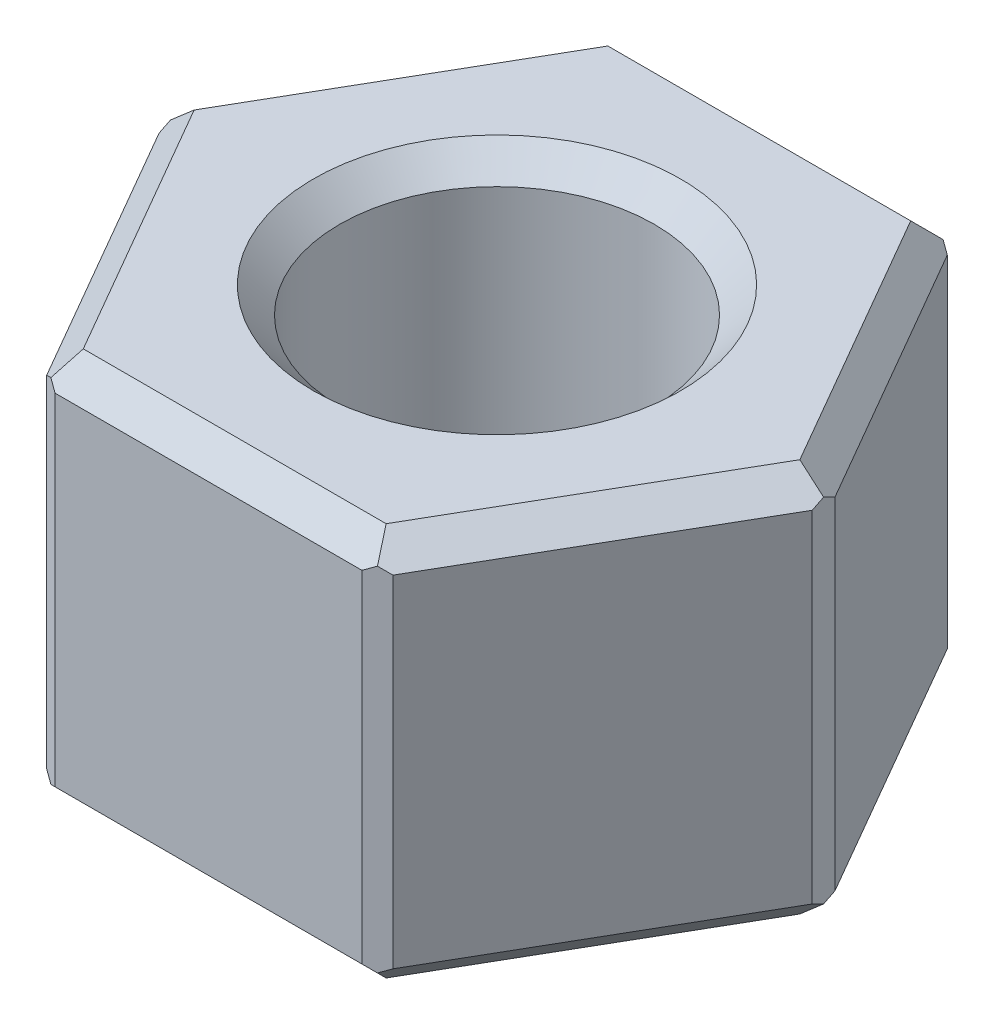
ISO-10303-21;
HEADER;
FILE_DESCRIPTION(('STEP AP214'),'2;1');
FILE_NAME('part.step','',(''),(''),'','','');
FILE_SCHEMA(('AUTOMOTIVE_DESIGN { 1 0 10303 214 1 1 1 1 }'));
ENDSEC;
DATA;
#1=APPLICATION_CONTEXT('core data for automotive mechanical design processes');
#2=APPLICATION_PROTOCOL_DEFINITION('international standard','automotive_design',2000,#1);
#3=PRODUCT_CONTEXT('',#1,'mechanical');
#4=PRODUCT('Part','Part','',(#3));
#5=PRODUCT_RELATED_PRODUCT_CATEGORY('part','',(#4));
#6=PRODUCT_DEFINITION_FORMATION('','',#4);
#7=PRODUCT_DEFINITION_CONTEXT('part definition',#1,'design');
#8=PRODUCT_DEFINITION('design','',#6,#7);
#9=PRODUCT_DEFINITION_SHAPE('','',#8);
#10=(LENGTH_UNIT() NAMED_UNIT(*) SI_UNIT(.MILLI.,.METRE.));
#11=(NAMED_UNIT(*) PLANE_ANGLE_UNIT() SI_UNIT($,.RADIAN.));
#12=(NAMED_UNIT(*) SI_UNIT($,.STERADIAN.) SOLID_ANGLE_UNIT());
#13=UNCERTAINTY_MEASURE_WITH_UNIT(LENGTH_MEASURE(1.E-05),#10,'distance_accuracy_value','');
#14=(GEOMETRIC_REPRESENTATION_CONTEXT(3) GLOBAL_UNCERTAINTY_ASSIGNED_CONTEXT((#13)) GLOBAL_UNIT_ASSIGNED_CONTEXT((#10,
#11,#12)) REPRESENTATION_CONTEXT('',''));
#15=CARTESIAN_POINT('',(0.,0.,0.));
#16=DIRECTION('',(0.,0.,1.));
#17=DIRECTION('',(1.,0.,0.));
#18=AXIS2_PLACEMENT_3D('',#15,#16,#17);
#19=CARTESIAN_POINT('',(0.,15.,0.));
#20=DIRECTION('',(0.,1.,0.));
#21=DIRECTION('',(0.,0.,1.));
#22=AXIS2_PLACEMENT_3D('',#19,#20,#21);
#23=PLANE('',#22);
#24=CARTESIAN_POINT('',(0.,15.,0.));
#25=DIRECTION('',(0.,1.,0.));
#26=DIRECTION('',(0.,0.,1.));
#27=AXIS2_PLACEMENT_3D('',#24,#25,#26);
#28=CIRCLE('',#27,7.00000000000001);
#29=CARTESIAN_POINT('',(0.,15.,7.00000000000001));
#30=VERTEX_POINT('',#29);
#31=EDGE_CURVE('E302',#30,#30,#28,.F.);
#32=ORIENTED_EDGE('',*,*,#31,.T.);
#33=EDGE_LOOP('',(#32));
#34=FACE_BOUND('',#33,.T.);
#35=DIRECTION('',(-0.5,0.,0.866025403784439));
#36=VECTOR('',#35,1.);
#37=CARTESIAN_POINT('',(-11.8356805183873,15.,0.499999999999998));
#38=LINE('',#37,#36);
#39=CARTESIAN_POINT('',(-5.77350269189626,15.,-10.));
#40=VERTEX_POINT('',#39);
#41=CARTESIAN_POINT('',(-11.5470053837925,15.,0.));
#42=VERTEX_POINT('',#41);
#43=EDGE_CURVE('E297',#40,#42,#38,.T.);
#44=ORIENTED_EDGE('',*,*,#43,.T.);
#45=DIRECTION('',(0.5,0.,0.866025403784439));
#46=VECTOR('',#45,1.);
#47=CARTESIAN_POINT('',(-5.48482755730145,15.,10.5));
#48=LINE('',#47,#46);
#49=CARTESIAN_POINT('',(-5.77350269189626,15.,10.));
#50=VERTEX_POINT('',#49);
#51=EDGE_CURVE('E299',#42,#50,#48,.T.);
#52=ORIENTED_EDGE('',*,*,#51,.T.);
#53=DIRECTION('',(1.,0.,0.));
#54=VECTOR('',#53,1.);
#55=CARTESIAN_POINT('',(6.35085296108588,15.,10.));
#56=LINE('',#55,#54);
#57=CARTESIAN_POINT('',(5.77350269189626,15.,10.));
#58=VERTEX_POINT('',#57);
#59=EDGE_CURVE('E287',#50,#58,#56,.T.);
#60=ORIENTED_EDGE('',*,*,#59,.T.);
#61=DIRECTION('',(0.5,0.,-0.866025403784439));
#62=VECTOR('',#61,1.);
#63=CARTESIAN_POINT('',(11.8356805183873,15.,-0.500000000000003));
#64=LINE('',#63,#62);
#65=CARTESIAN_POINT('',(11.5470053837925,15.,0.));
#66=VERTEX_POINT('',#65);
#67=EDGE_CURVE('E290',#58,#66,#64,.T.);
#68=ORIENTED_EDGE('',*,*,#67,.T.);
#69=DIRECTION('',(-0.5,0.,-0.866025403784439));
#70=VECTOR('',#69,1.);
#71=CARTESIAN_POINT('',(5.48482755730145,15.,-10.5));
#72=LINE('',#71,#70);
#73=CARTESIAN_POINT('',(5.77350269189626,15.,-10.));
#74=VERTEX_POINT('',#73);
#75=EDGE_CURVE('E293',#66,#74,#72,.T.);
#76=ORIENTED_EDGE('',*,*,#75,.T.);
#77=DIRECTION('',(-1.,0.,0.));
#78=VECTOR('',#77,1.);
#79=CARTESIAN_POINT('',(-6.35085296108588,15.,-10.));
#80=LINE('',#79,#78);
#81=EDGE_CURVE('E295',#74,#40,#80,.T.);
#82=ORIENTED_EDGE('',*,*,#81,.T.);
#83=EDGE_LOOP('',(#44,#52,#60,#68,#76,#82));
#84=FACE_BOUND('',#83,.T.);
#85=ADVANCED_FACE('F49',(#34,#84),#23,.T.);
#86=CARTESIAN_POINT('',(0.,0.,0.));
#87=DIRECTION('',(0.,1.,0.));
#88=DIRECTION('',(0.,0.,1.));
#89=AXIS2_PLACEMENT_3D('',#86,#87,#88);
#90=PLANE('',#89);
#91=CARTESIAN_POINT('',(0.,0.,0.));
#92=DIRECTION('',(0.,1.,0.));
#93=DIRECTION('',(0.,0.,1.));
#94=AXIS2_PLACEMENT_3D('',#91,#92,#93);
#95=CIRCLE('',#94,7.);
#96=CARTESIAN_POINT('',(0.,0.,7.));
#97=VERTEX_POINT('',#96);
#98=EDGE_CURVE('E239',#97,#97,#95,.T.);
#99=ORIENTED_EDGE('',*,*,#98,.T.);
#100=EDGE_LOOP('',(#99));
#101=FACE_BOUND('',#100,.T.);
#102=DIRECTION('',(0.5,0.,0.866025403784439));
#103=VECTOR('',#102,1.);
#104=CARTESIAN_POINT('',(8.66025403784439,0.,-5.));
#105=LINE('',#104,#103);
#106=CARTESIAN_POINT('',(5.77350269189626,0.,-10.));
#107=VERTEX_POINT('',#106);
#108=CARTESIAN_POINT('',(11.5470053837925,0.,0.));
#109=VERTEX_POINT('',#108);
#110=EDGE_CURVE('E238',#107,#109,#105,.T.);
#111=ORIENTED_EDGE('',*,*,#110,.T.);
#112=DIRECTION('',(-0.5,0.,0.866025403784439));
#113=VECTOR('',#112,1.);
#114=CARTESIAN_POINT('',(8.66025403784438,0.,5.));
#115=LINE('',#114,#113);
#116=CARTESIAN_POINT('',(5.77350269189625,0.,9.99999999999999));
#117=VERTEX_POINT('',#116);
#118=EDGE_CURVE('E217',#109,#117,#115,.T.);
#119=ORIENTED_EDGE('',*,*,#118,.T.);
#120=DIRECTION('',(-1.,0.,0.));
#121=VECTOR('',#120,1.);
#122=CARTESIAN_POINT('',(0.,0.,9.99999999999999));
#123=LINE('',#122,#121);
#124=CARTESIAN_POINT('',(-5.77350269189626,0.,9.99999999999999));
#125=VERTEX_POINT('',#124);
#126=EDGE_CURVE('E226',#117,#125,#123,.T.);
#127=ORIENTED_EDGE('',*,*,#126,.T.);
#128=DIRECTION('',(-0.5,0.,-0.866025403784439));
#129=VECTOR('',#128,1.);
#130=CARTESIAN_POINT('',(-8.66025403784439,0.,5.));
#131=LINE('',#130,#129);
#132=CARTESIAN_POINT('',(-11.5470053837925,0.,0.));
#133=VERTEX_POINT('',#132);
#134=EDGE_CURVE('E233',#125,#133,#131,.T.);
#135=ORIENTED_EDGE('',*,*,#134,.T.);
#136=DIRECTION('',(0.5,0.,-0.866025403784439));
#137=VECTOR('',#136,1.);
#138=CARTESIAN_POINT('',(-8.66025403784439,0.,-5.));
#139=LINE('',#138,#137);
#140=CARTESIAN_POINT('',(-5.77350269189626,0.,-10.));
#141=VERTEX_POINT('',#140);
#142=EDGE_CURVE('E493',#133,#141,#139,.T.);
#143=ORIENTED_EDGE('',*,*,#142,.T.);
#144=DIRECTION('',(1.,0.,0.));
#145=VECTOR('',#144,1.);
#146=CARTESIAN_POINT('',(0.,0.,-10.));
#147=LINE('',#146,#145);
#148=EDGE_CURVE('E244',#141,#107,#147,.T.);
#149=ORIENTED_EDGE('',*,*,#148,.T.);
#150=EDGE_LOOP('',(#111,#119,#127,#135,#143,#149));
#151=FACE_BOUND('',#150,.T.);
#152=ADVANCED_FACE('F236',(#101,#151),#90,.F.);
#153=CARTESIAN_POINT('',(-6.35085296108589,15.,11.));
#154=DIRECTION('',(0.,0.,-1.));
#155=DIRECTION('',(-1.,0.,0.));
#156=AXIS2_PLACEMENT_3D('',#153,#154,#155);
#157=PLANE('',#156);
#158=DIRECTION('',(1.,0.,0.));
#159=VECTOR('',#158,1.);
#160=CARTESIAN_POINT('',(-6.35085296108589,0.999999999999997,11.));
#161=LINE('',#160,#159);
#162=CARTESIAN_POINT('',(-5.85085296108589,0.999999999999997,11.));
#163=VERTEX_POINT('',#162);
#164=CARTESIAN_POINT('',(5.85085296108588,0.999999999999997,11.));
#165=VERTEX_POINT('',#164);
#166=EDGE_CURVE('E284',#163,#165,#161,.T.);
#167=ORIENTED_EDGE('',*,*,#166,.T.);
#168=DIRECTION('',(0.,1.,0.));
#169=VECTOR('',#168,1.);
#170=CARTESIAN_POINT('',(5.85085296108588,15.,11.));
#171=LINE('',#170,#169);
#172=CARTESIAN_POINT('',(5.85085296108588,14.,11.));
#173=VERTEX_POINT('',#172);
#174=EDGE_CURVE('E342',#165,#173,#171,.T.);
#175=ORIENTED_EDGE('',*,*,#174,.T.);
#176=DIRECTION('',(-1.,0.,0.));
#177=VECTOR('',#176,1.);
#178=CARTESIAN_POINT('',(-6.35085296108589,14.,11.));
#179=LINE('',#178,#177);
#180=CARTESIAN_POINT('',(-5.85085296108589,14.,11.));
#181=VERTEX_POINT('',#180);
#182=EDGE_CURVE('E281',#173,#181,#179,.T.);
#183=ORIENTED_EDGE('',*,*,#182,.T.);
#184=DIRECTION('',(0.,-1.,0.));
#185=VECTOR('',#184,1.);
#186=CARTESIAN_POINT('',(-5.85085296108589,15.,11.));
#187=LINE('',#186,#185);
#188=EDGE_CURVE('E339',#181,#163,#187,.T.);
#189=ORIENTED_EDGE('',*,*,#188,.T.);
#190=EDGE_LOOP('',(#167,#175,#183,#189));
#191=FACE_BOUND('',#190,.T.);
#192=ADVANCED_FACE('F412',(#191),#157,.F.);
#193=CARTESIAN_POINT('',(6.35085296108588,15.,11.));
#194=DIRECTION('',(-0.866025403784438,0.,-0.5));
#195=DIRECTION('',(-0.5,0.,0.866025403784439));
#196=AXIS2_PLACEMENT_3D('',#193,#194,#195);
#197=PLANE('',#196);
#198=DIRECTION('',(-0.5,0.,0.866025403784439));
#199=VECTOR('',#198,1.);
#200=CARTESIAN_POINT('',(6.35085296108588,14.,11.));
#201=LINE('',#200,#199);
#202=CARTESIAN_POINT('',(12.4517059221718,14.,0.433012701892214));
#203=VERTEX_POINT('',#202);
#204=CARTESIAN_POINT('',(6.60085296108588,14.,10.5669872981078));
#205=VERTEX_POINT('',#204);
#206=EDGE_CURVE('E253',#203,#205,#201,.T.);
#207=ORIENTED_EDGE('',*,*,#206,.T.);
#208=DIRECTION('',(0.,-1.,0.));
#209=VECTOR('',#208,1.);
#210=CARTESIAN_POINT('',(6.60085296108588,15.,10.5669872981078));
#211=LINE('',#210,#209);
#212=CARTESIAN_POINT('',(6.60085296108588,0.999999999999997,10.5669872981078));
#213=VERTEX_POINT('',#212);
#214=EDGE_CURVE('E329',#205,#213,#211,.T.);
#215=ORIENTED_EDGE('',*,*,#214,.T.);
#216=DIRECTION('',(0.5,0.,-0.866025403784439));
#217=VECTOR('',#216,1.);
#218=CARTESIAN_POINT('',(6.35085296108588,0.999999999999997,11.));
#219=LINE('',#218,#217);
#220=CARTESIAN_POINT('',(12.4517059221718,0.999999999999997,0.433012701892214));
#221=VERTEX_POINT('',#220);
#222=EDGE_CURVE('E256',#213,#221,#219,.T.);
#223=ORIENTED_EDGE('',*,*,#222,.T.);
#224=DIRECTION('',(0.,1.,0.));
#225=VECTOR('',#224,1.);
#226=CARTESIAN_POINT('',(12.4517059221718,15.,0.433012701892218));
#227=LINE('',#226,#225);
#228=EDGE_CURVE('E305',#221,#203,#227,.T.);
#229=ORIENTED_EDGE('',*,*,#228,.T.);
#230=EDGE_LOOP('',(#207,#215,#223,#229));
#231=FACE_BOUND('',#230,.T.);
#232=ADVANCED_FACE('F425',(#231),#197,.F.);
#233=CARTESIAN_POINT('',(12.7017059221718,15.,0.));
#234=DIRECTION('',(-0.866025403784439,0.,0.5));
#235=DIRECTION('',(0.5,0.,0.866025403784439));
#236=AXIS2_PLACEMENT_3D('',#233,#234,#235);
#237=PLANE('',#236);
#238=DIRECTION('',(0.5,0.,0.866025403784439));
#239=VECTOR('',#238,1.);
#240=CARTESIAN_POINT('',(12.7017059221718,14.,0.));
#241=LINE('',#240,#239);
#242=CARTESIAN_POINT('',(6.60085296108589,14.,-10.5669872981078));
#243=VERTEX_POINT('',#242);
#244=CARTESIAN_POINT('',(12.4517059221718,14.,-0.433012701892225));
#245=VERTEX_POINT('',#244);
#246=EDGE_CURVE('E259',#243,#245,#241,.T.);
#247=ORIENTED_EDGE('',*,*,#246,.T.);
#248=DIRECTION('',(0.,-1.,0.));
#249=VECTOR('',#248,1.);
#250=CARTESIAN_POINT('',(12.4517059221718,15.,-0.433012701892225));
#251=LINE('',#250,#249);
#252=CARTESIAN_POINT('',(12.4517059221718,0.999999999999997,-0.433012701892225));
#253=VERTEX_POINT('',#252);
#254=EDGE_CURVE('E354',#245,#253,#251,.T.);
#255=ORIENTED_EDGE('',*,*,#254,.T.);
#256=DIRECTION('',(-0.5,0.,-0.866025403784439));
#257=VECTOR('',#256,1.);
#258=CARTESIAN_POINT('',(12.7017059221718,0.999999999999997,0.));
#259=LINE('',#258,#257);
#260=CARTESIAN_POINT('',(6.60085296108589,0.999999999999997,-10.5669872981078));
#261=VERTEX_POINT('',#260);
#262=EDGE_CURVE('E262',#253,#261,#259,.T.);
#263=ORIENTED_EDGE('',*,*,#262,.T.);
#264=DIRECTION('',(0.,1.,0.));
#265=VECTOR('',#264,1.);
#266=CARTESIAN_POINT('',(6.60085296108589,15.,-10.5669872981078));
#267=LINE('',#266,#265);
#268=EDGE_CURVE('E352',#261,#243,#267,.T.);
#269=ORIENTED_EDGE('',*,*,#268,.T.);
#270=EDGE_LOOP('',(#247,#255,#263,#269));
#271=FACE_BOUND('',#270,.T.);
#272=ADVANCED_FACE('F441',(#271),#237,.F.);
#273=CARTESIAN_POINT('',(6.35085296108589,15.,-11.));
#274=DIRECTION('',(0.,0.,1.));
#275=DIRECTION('',(1.,0.,0.));
#276=AXIS2_PLACEMENT_3D('',#273,#274,#275);
#277=PLANE('',#276);
#278=DIRECTION('',(1.,0.,0.));
#279=VECTOR('',#278,1.);
#280=CARTESIAN_POINT('',(6.35085296108589,14.,-11.));
#281=LINE('',#280,#279);
#282=CARTESIAN_POINT('',(-5.85085296108588,14.,-11.));
#283=VERTEX_POINT('',#282);
#284=CARTESIAN_POINT('',(5.85085296108589,14.,-11.));
#285=VERTEX_POINT('',#284);
#286=EDGE_CURVE('E265',#283,#285,#281,.T.);
#287=ORIENTED_EDGE('',*,*,#286,.T.);
#288=DIRECTION('',(0.,-1.,0.));
#289=VECTOR('',#288,1.);
#290=CARTESIAN_POINT('',(5.85085296108589,15.,-11.));
#291=LINE('',#290,#289);
#292=CARTESIAN_POINT('',(5.85085296108589,0.999999999999997,-11.));
#293=VERTEX_POINT('',#292);
#294=EDGE_CURVE('E367',#285,#293,#291,.T.);
#295=ORIENTED_EDGE('',*,*,#294,.T.);
#296=DIRECTION('',(-1.,0.,0.));
#297=VECTOR('',#296,1.);
#298=CARTESIAN_POINT('',(6.35085296108589,0.999999999999997,-11.));
#299=LINE('',#298,#297);
#300=CARTESIAN_POINT('',(-5.85085296108588,0.999999999999997,-11.));
#301=VERTEX_POINT('',#300);
#302=EDGE_CURVE('E268',#293,#301,#299,.T.);
#303=ORIENTED_EDGE('',*,*,#302,.T.);
#304=DIRECTION('',(0.,1.,0.));
#305=VECTOR('',#304,1.);
#306=CARTESIAN_POINT('',(-5.85085296108588,15.,-11.));
#307=LINE('',#306,#305);
#308=EDGE_CURVE('E365',#301,#283,#307,.T.);
#309=ORIENTED_EDGE('',*,*,#308,.T.);
#310=EDGE_LOOP('',(#287,#295,#303,#309));
#311=FACE_BOUND('',#310,.T.);
#312=ADVANCED_FACE('F459',(#311),#277,.F.);
#313=CARTESIAN_POINT('',(-6.35085296108588,15.,-11.));
#314=DIRECTION('',(0.866025403784439,0.,0.5));
#315=DIRECTION('',(0.5,0.,-0.866025403784439));
#316=AXIS2_PLACEMENT_3D('',#313,#314,#315);
#317=PLANE('',#316);
#318=DIRECTION('',(0.5,0.,-0.866025403784439));
#319=VECTOR('',#318,1.);
#320=CARTESIAN_POINT('',(-6.35085296108588,14.,-11.));
#321=LINE('',#320,#319);
#322=CARTESIAN_POINT('',(-12.4517059221718,14.,-0.433012701892218));
#323=VERTEX_POINT('',#322);
#324=CARTESIAN_POINT('',(-6.60085296108588,14.,-10.5669872981078));
#325=VERTEX_POINT('',#324);
#326=EDGE_CURVE('E271',#323,#325,#321,.T.);
#327=ORIENTED_EDGE('',*,*,#326,.T.);
#328=DIRECTION('',(0.,-1.,0.));
#329=VECTOR('',#328,1.);
#330=CARTESIAN_POINT('',(-6.60085296108588,15.,-10.5669872981078));
#331=LINE('',#330,#329);
#332=CARTESIAN_POINT('',(-6.60085296108588,0.999999999999997,-10.5669872981078));
#333=VERTEX_POINT('',#332);
#334=EDGE_CURVE('E380',#325,#333,#331,.T.);
#335=ORIENTED_EDGE('',*,*,#334,.T.);
#336=DIRECTION('',(-0.5,0.,0.866025403784439));
#337=VECTOR('',#336,1.);
#338=CARTESIAN_POINT('',(-6.35085296108588,0.999999999999997,-11.));
#339=LINE('',#338,#337);
#340=CARTESIAN_POINT('',(-12.4517059221718,0.999999999999997,-0.433012701892218));
#341=VERTEX_POINT('',#340);
#342=EDGE_CURVE('E274',#333,#341,#339,.T.);
#343=ORIENTED_EDGE('',*,*,#342,.T.);
#344=DIRECTION('',(0.,1.,0.));
#345=VECTOR('',#344,1.);
#346=CARTESIAN_POINT('',(-12.4517059221718,15.,-0.433012701892218));
#347=LINE('',#346,#345);
#348=EDGE_CURVE('E378',#341,#323,#347,.T.);
#349=ORIENTED_EDGE('',*,*,#348,.T.);
#350=EDGE_LOOP('',(#327,#335,#343,#349));
#351=FACE_BOUND('',#350,.T.);
#352=ADVANCED_FACE('F478',(#351),#317,.F.);
#353=CARTESIAN_POINT('',(-12.7017059221718,15.,0.));
#354=DIRECTION('',(0.866025403784439,0.,-0.5));
#355=DIRECTION('',(-0.5,0.,-0.866025403784439));
#356=AXIS2_PLACEMENT_3D('',#353,#354,#355);
#357=PLANE('',#356);
#358=DIRECTION('',(-0.5,0.,-0.866025403784439));
#359=VECTOR('',#358,1.);
#360=CARTESIAN_POINT('',(-12.7017059221718,14.,0.));
#361=LINE('',#360,#359);
#362=CARTESIAN_POINT('',(-6.60085296108589,14.,10.5669872981078));
#363=VERTEX_POINT('',#362);
#364=CARTESIAN_POINT('',(-12.4517059221718,14.,0.433012701892216));
#365=VERTEX_POINT('',#364);
#366=EDGE_CURVE('E277',#363,#365,#361,.T.);
#367=ORIENTED_EDGE('',*,*,#366,.T.);
#368=DIRECTION('',(0.,-1.,0.));
#369=VECTOR('',#368,1.);
#370=CARTESIAN_POINT('',(-12.4517059221718,15.,0.433012701892216));
#371=LINE('',#370,#369);
#372=CARTESIAN_POINT('',(-12.4517059221718,0.999999999999997,0.433012701892216));
#373=VERTEX_POINT('',#372);
#374=EDGE_CURVE('E392',#365,#373,#371,.T.);
#375=ORIENTED_EDGE('',*,*,#374,.T.);
#376=DIRECTION('',(0.5,0.,0.866025403784439));
#377=VECTOR('',#376,1.);
#378=CARTESIAN_POINT('',(-12.7017059221718,0.999999999999997,0.));
#379=LINE('',#378,#377);
#380=CARTESIAN_POINT('',(-6.60085296108589,0.999999999999997,10.5669872981078));
#381=VERTEX_POINT('',#380);
#382=EDGE_CURVE('E279',#373,#381,#379,.T.);
#383=ORIENTED_EDGE('',*,*,#382,.T.);
#384=DIRECTION('',(0.,1.,0.));
#385=VECTOR('',#384,1.);
#386=CARTESIAN_POINT('',(-6.60085296108589,15.,10.5669872981078));
#387=LINE('',#386,#385);
#388=EDGE_CURVE('E70',#381,#363,#387,.T.);
#389=ORIENTED_EDGE('',*,*,#388,.T.);
#390=EDGE_LOOP('',(#367,#375,#383,#389));
#391=FACE_BOUND('',#390,.T.);
#392=ADVANCED_FACE('F490',(#391),#357,.F.);
#393=CARTESIAN_POINT('',(0.,15.,0.));
#394=DIRECTION('',(0.,-1.,0.));
#395=DIRECTION('',(0.,0.,-1.));
#396=AXIS2_PLACEMENT_3D('',#393,#394,#395);
#397=CYLINDRICAL_SURFACE('',#396,6.);
#398=CARTESIAN_POINT('',(0.,1.,0.));
#399=DIRECTION('',(0.,1.,0.));
#400=DIRECTION('',(0.,0.,1.));
#401=AXIS2_PLACEMENT_3D('',#398,#399,#400);
#402=CIRCLE('',#401,6.);
#403=CARTESIAN_POINT('',(0.,1.,6.));
#404=VERTEX_POINT('',#403);
#405=EDGE_CURVE('E250',#404,#404,#402,.F.);
#406=ORIENTED_EDGE('',*,*,#405,.T.);
#407=EDGE_LOOP('',(#406));
#408=FACE_BOUND('',#407,.T.);
#409=CARTESIAN_POINT('',(0.,14.,0.));
#410=DIRECTION('',(0.,1.,0.));
#411=DIRECTION('',(0.,0.,1.));
#412=AXIS2_PLACEMENT_3D('',#409,#410,#411);
#413=CIRCLE('',#412,6.);
#414=CARTESIAN_POINT('',(0.,14.,6.));
#415=VERTEX_POINT('',#414);
#416=EDGE_CURVE('E242',#415,#415,#413,.T.);
#417=ORIENTED_EDGE('',*,*,#416,.T.);
#418=EDGE_LOOP('',(#417));
#419=FACE_BOUND('',#418,.T.);
#420=ADVANCED_FACE('F518',(#408,#419),#397,.F.);
#421=CARTESIAN_POINT('',(0.,0.,0.));
#422=DIRECTION('',(0.,-1.,0.));
#423=DIRECTION('',(0.,0.,-1.));
#424=AXIS2_PLACEMENT_3D('',#421,#422,#423);
#425=CONICAL_SURFACE('',#424,7.,0.785398163397447);
#426=ORIENTED_EDGE('',*,*,#405,.F.);
#427=EDGE_LOOP('',(#426));
#428=FACE_BOUND('',#427,.T.);
#429=ORIENTED_EDGE('',*,*,#98,.F.);
#430=EDGE_LOOP('',(#429));
#431=FACE_BOUND('',#430,.T.);
#432=ADVANCED_FACE('F503',(#428,#431),#425,.F.);
#433=CARTESIAN_POINT('',(-6.35085296108588,0.999999999999997,-11.));
#434=DIRECTION('',(0.612372435695794,0.707106781186548,0.353553390593273));
#435=DIRECTION('',(-0.5,0.,0.866025403784439));
#436=AXIS2_PLACEMENT_3D('',#433,#434,#435);
#437=PLANE('',#436);
#438=ORIENTED_EDGE('',*,*,#342,.F.);
#439=DIRECTION('',(0.774596669241485,-0.447213595499961,-0.447213595499952));
#440=VECTOR('',#439,1.);
#441=CARTESIAN_POINT('',(-6.30085296108589,0.826794919243112,-10.7401923788647));
#442=LINE('',#441,#440);
#443=CARTESIAN_POINT('',(-6.22585296108589,0.783493649053889,-10.7834936490539));
#444=VERTEX_POINT('',#443);
#445=EDGE_CURVE('E385',#333,#444,#442,.T.);
#446=ORIENTED_EDGE('',*,*,#445,.T.);
#447=DIRECTION('',(0.377964473009227,-0.654653670707976,0.654653670707978));
#448=VECTOR('',#447,1.);
#449=CARTESIAN_POINT('',(-6.35085296108588,0.999999999999997,-11.));
#450=LINE('',#449,#448);
#451=EDGE_CURVE('E311',#141,#444,#450,.F.);
#452=ORIENTED_EDGE('',*,*,#451,.F.);
#453=ORIENTED_EDGE('',*,*,#142,.F.);
#454=DIRECTION('',(0.755928946018455,-0.654653670707976,0.));
#455=VECTOR('',#454,1.);
#456=CARTESIAN_POINT('',(-12.7017059221718,0.999999999999997,0.));
#457=LINE('',#456,#455);
#458=CARTESIAN_POINT('',(-12.4517059221718,0.783493649053888,0.));
#459=VERTEX_POINT('',#458);
#460=EDGE_CURVE('E234',#459,#133,#457,.T.);
#461=ORIENTED_EDGE('',*,*,#460,.F.);
#462=DIRECTION('',(0.,0.447213595499956,-0.894427190999917));
#463=VECTOR('',#462,1.);
#464=CARTESIAN_POINT('',(-12.4517059221717,5.2267949192431,-8.88660254037847));
#465=LINE('',#464,#463);
#466=EDGE_CURVE('E383',#459,#341,#465,.T.);
#467=ORIENTED_EDGE('',*,*,#466,.T.);
#468=EDGE_LOOP('',(#438,#446,#452,#453,#461,#467));
#469=FACE_BOUND('',#468,.T.);
#470=ADVANCED_FACE('F481',(#469),#437,.F.);
#471=CARTESIAN_POINT('',(-12.7017059221718,0.999999999999997,0.));
#472=DIRECTION('',(0.612372435695794,0.707106781186549,-0.353553390593273));
#473=DIRECTION('',(0.5,0.,0.866025403784439));
#474=AXIS2_PLACEMENT_3D('',#471,#472,#473);
#475=PLANE('',#474);
#476=ORIENTED_EDGE('',*,*,#382,.F.);
#477=DIRECTION('',(0.,-0.447213595499958,-0.894427190999916));
#478=VECTOR('',#477,1.);
#479=CARTESIAN_POINT('',(-12.4517059221718,0.826794919243111,0.0866025403784433));
#480=LINE('',#479,#478);
#481=EDGE_CURVE('E397',#373,#459,#480,.T.);
#482=ORIENTED_EDGE('',*,*,#481,.T.);
#483=ORIENTED_EDGE('',*,*,#460,.T.);
#484=ORIENTED_EDGE('',*,*,#134,.F.);
#485=DIRECTION('',(0.377964473009228,-0.654653670707976,-0.654653670707978));
#486=VECTOR('',#485,1.);
#487=CARTESIAN_POINT('',(-6.35085296108589,0.999999999999997,11.));
#488=LINE('',#487,#486);
#489=CARTESIAN_POINT('',(-6.22585296108589,0.783493649053889,10.7834936490539));
#490=VERTEX_POINT('',#489);
#491=EDGE_CURVE('E229',#490,#125,#488,.T.);
#492=ORIENTED_EDGE('',*,*,#491,.F.);
#493=DIRECTION('',(-0.774596669241483,0.447213595499953,-0.447213595499964));
#494=VECTOR('',#493,1.);
#495=CARTESIAN_POINT('',(-13.921876514389,5.22679491924308,6.34019237886458));
#496=LINE('',#495,#494);
#497=EDGE_CURVE('E395',#490,#381,#496,.T.);
#498=ORIENTED_EDGE('',*,*,#497,.T.);
#499=EDGE_LOOP('',(#476,#482,#483,#484,#492,#498));
#500=FACE_BOUND('',#499,.T.);
#501=ADVANCED_FACE('F492',(#500),#475,.F.);
#502=CARTESIAN_POINT('',(6.35085296108589,0.999999999999997,-11.));
#503=DIRECTION('',(0.,0.707106781186549,0.707106781186546));
#504=DIRECTION('',(-1.,0.,0.));
#505=AXIS2_PLACEMENT_3D('',#502,#503,#504);
#506=PLANE('',#505);
#507=ORIENTED_EDGE('',*,*,#302,.F.);
#508=DIRECTION('',(0.77459666924148,-0.44721359549996,0.447213595499962));
#509=VECTOR('',#508,1.);
#510=CARTESIAN_POINT('',(6.15085296108589,0.826794919243112,-10.8267949192431));
#511=LINE('',#510,#509);
#512=CARTESIAN_POINT('',(6.22585296108589,0.78349364905389,-10.7834936490539));
#513=VERTEX_POINT('',#512);
#514=EDGE_CURVE('E372',#293,#513,#511,.T.);
#515=ORIENTED_EDGE('',*,*,#514,.T.);
#516=DIRECTION('',(-0.377964473009227,-0.654653670707976,0.654653670707979));
#517=VECTOR('',#516,1.);
#518=CARTESIAN_POINT('',(6.35085296108588,0.999999999999998,-11.));
#519=LINE('',#518,#517);
#520=EDGE_CURVE('E222',#107,#513,#519,.F.);
#521=ORIENTED_EDGE('',*,*,#520,.F.);
#522=ORIENTED_EDGE('',*,*,#148,.F.);
#523=ORIENTED_EDGE('',*,*,#451,.T.);
#524=DIRECTION('',(0.774596669241488,0.447213595499953,-0.447213595499954));
#525=VECTOR('',#524,1.);
#526=CARTESIAN_POINT('',(1.47017059221727,5.22679491924309,-15.2267949192431));
#527=LINE('',#526,#525);
#528=EDGE_CURVE('E370',#444,#301,#527,.T.);
#529=ORIENTED_EDGE('',*,*,#528,.T.);
#530=EDGE_LOOP('',(#507,#515,#521,#522,#523,#529));
#531=FACE_BOUND('',#530,.T.);
#532=ADVANCED_FACE('F462',(#531),#506,.F.);
#533=CARTESIAN_POINT('',(-6.35085296108589,0.999999999999997,11.));
#534=DIRECTION('',(0.,0.707106781186549,-0.707106781186546));
#535=DIRECTION('',(1.,0.,0.));
#536=AXIS2_PLACEMENT_3D('',#533,#534,#535);
#537=PLANE('',#536);
#538=DIRECTION('',(0.377964473009228,0.654653670707976,0.654653670707978));
#539=VECTOR('',#538,1.);
#540=CARTESIAN_POINT('',(4.53632354363276,-2.14285714285714,7.85714285714284));
#541=LINE('',#540,#539);
#542=CARTESIAN_POINT('',(6.22585296108588,0.783493649053891,10.7834936490539));
#543=VERTEX_POINT('',#542);
#544=EDGE_CURVE('E211',#543,#117,#541,.F.);
#545=ORIENTED_EDGE('',*,*,#544,.F.);
#546=DIRECTION('',(-0.774596669241487,0.447213595499954,0.447213595499955));
#547=VECTOR('',#546,1.);
#548=CARTESIAN_POINT('',(-1.47017059221726,5.22679491924309,15.2267949192431));
#549=LINE('',#548,#547);
#550=EDGE_CURVE('E337',#543,#165,#549,.T.);
#551=ORIENTED_EDGE('',*,*,#550,.T.);
#552=ORIENTED_EDGE('',*,*,#166,.F.);
#553=DIRECTION('',(-0.774596669241479,-0.447213595499961,-0.447213595499962));
#554=VECTOR('',#553,1.);
#555=CARTESIAN_POINT('',(-6.15085296108589,0.826794919243112,10.8267949192431));
#556=LINE('',#555,#554);
#557=EDGE_CURVE('E335',#163,#490,#556,.T.);
#558=ORIENTED_EDGE('',*,*,#557,.T.);
#559=ORIENTED_EDGE('',*,*,#491,.T.);
#560=ORIENTED_EDGE('',*,*,#126,.F.);
#561=EDGE_LOOP('',(#545,#551,#552,#558,#559,#560));
#562=FACE_BOUND('',#561,.T.);
#563=ADVANCED_FACE('F227',(#562),#537,.F.);
#564=CARTESIAN_POINT('',(12.7017059221718,0.999999999999997,0.));
#565=DIRECTION('',(-0.612372435695794,0.707106781186548,0.353553390593273));
#566=DIRECTION('',(-0.5,0.,-0.866025403784439));
#567=AXIS2_PLACEMENT_3D('',#564,#565,#566);
#568=PLANE('',#567);
#569=ORIENTED_EDGE('',*,*,#262,.F.);
#570=DIRECTION('',(0.,-0.447213595499959,0.894427190999916));
#571=VECTOR('',#570,1.);
#572=CARTESIAN_POINT('',(12.4517059221718,0.82679491924311,-0.0866025403784496));
#573=LINE('',#572,#571);
#574=CARTESIAN_POINT('',(12.4517059221718,0.783493649053887,0.));
#575=VERTEX_POINT('',#574);
#576=EDGE_CURVE('E359',#253,#575,#573,.T.);
#577=ORIENTED_EDGE('',*,*,#576,.T.);
#578=DIRECTION('',(-0.755928946018455,-0.654653670707976,0.));
#579=VECTOR('',#578,1.);
#580=CARTESIAN_POINT('',(12.7017059221718,0.999999999999997,0.));
#581=LINE('',#580,#579);
#582=EDGE_CURVE('E223',#109,#575,#581,.F.);
#583=ORIENTED_EDGE('',*,*,#582,.F.);
#584=ORIENTED_EDGE('',*,*,#110,.F.);
#585=ORIENTED_EDGE('',*,*,#520,.T.);
#586=DIRECTION('',(0.774596669241483,0.447213595499954,0.447213595499963));
#587=VECTOR('',#586,1.);
#588=CARTESIAN_POINT('',(13.921876514389,5.22679491924309,-6.3401923788646));
#589=LINE('',#588,#587);
#590=EDGE_CURVE('E357',#513,#261,#589,.T.);
#591=ORIENTED_EDGE('',*,*,#590,.T.);
#592=EDGE_LOOP('',(#569,#577,#583,#584,#585,#591));
#593=FACE_BOUND('',#592,.T.);
#594=ADVANCED_FACE('F444',(#593),#568,.F.);
#595=CARTESIAN_POINT('',(6.35085296108588,0.999999999999997,11.));
#596=DIRECTION('',(-0.612372435695793,0.707106781186549,-0.353553390593273));
#597=DIRECTION('',(0.5,0.,-0.866025403784439));
#598=AXIS2_PLACEMENT_3D('',#595,#596,#597);
#599=PLANE('',#598);
#600=ORIENTED_EDGE('',*,*,#222,.F.);
#601=DIRECTION('',(-0.774596669241485,-0.447213595499959,0.447213595499954));
#602=VECTOR('',#601,1.);
#603=CARTESIAN_POINT('',(6.30085296108588,0.826794919243112,10.7401923788647));
#604=LINE('',#603,#602);
#605=EDGE_CURVE('E219',#213,#543,#604,.T.);
#606=ORIENTED_EDGE('',*,*,#605,.T.);
#607=ORIENTED_EDGE('',*,*,#544,.T.);
#608=ORIENTED_EDGE('',*,*,#118,.F.);
#609=ORIENTED_EDGE('',*,*,#582,.T.);
#610=DIRECTION('',(0.,0.447213595499955,0.894427190999917));
#611=VECTOR('',#610,1.);
#612=CARTESIAN_POINT('',(12.4517059221717,5.2267949192431,8.88660254037847));
#613=LINE('',#612,#611);
#614=EDGE_CURVE('E332',#575,#221,#613,.T.);
#615=ORIENTED_EDGE('',*,*,#614,.T.);
#616=EDGE_LOOP('',(#600,#606,#607,#608,#609,#615));
#617=FACE_BOUND('',#616,.T.);
#618=ADVANCED_FACE('F214',(#617),#599,.F.);
#619=CARTESIAN_POINT('',(0.,14.,0.));
#620=DIRECTION('',(0.,1.,0.));
#621=DIRECTION('',(0.,0.,1.));
#622=AXIS2_PLACEMENT_3D('',#619,#620,#621);
#623=CONICAL_SURFACE('',#622,6.,0.78539816339745);
#624=ORIENTED_EDGE('',*,*,#31,.F.);
#625=EDGE_LOOP('',(#624));
#626=FACE_BOUND('',#625,.T.);
#627=ORIENTED_EDGE('',*,*,#416,.F.);
#628=EDGE_LOOP('',(#627));
#629=FACE_BOUND('',#628,.T.);
#630=ADVANCED_FACE('F546',(#626,#629),#623,.F.);
#631=CARTESIAN_POINT('',(8.66025403784439,15.,-5.));
#632=DIRECTION('',(0.612372435695796,0.707106781186545,-0.353553390593275));
#633=DIRECTION('',(0.5,0.,0.866025403784439));
#634=AXIS2_PLACEMENT_3D('',#631,#632,#633);
#635=PLANE('',#634);
#636=DIRECTION('',(-0.755928946018453,0.654653670707979,0.));
#637=VECTOR('',#636,1.);
#638=CARTESIAN_POINT('',(9.89743318610788,16.4285714285714,0.));
#639=LINE('',#638,#637);
#640=CARTESIAN_POINT('',(12.4517059221718,14.2165063509461,0.));
#641=VERTEX_POINT('',#640);
#642=EDGE_CURVE('E324',#641,#66,#639,.T.);
#643=ORIENTED_EDGE('',*,*,#642,.F.);
#644=DIRECTION('',(0.,0.447213595499961,0.894427190999914));
#645=VECTOR('',#644,1.);
#646=CARTESIAN_POINT('',(12.4517059221718,12.3732050807569,-3.68660254037842));
#647=LINE('',#646,#645);
#648=EDGE_CURVE('E363',#641,#245,#647,.F.);
#649=ORIENTED_EDGE('',*,*,#648,.T.);
#650=ORIENTED_EDGE('',*,*,#246,.F.);
#651=DIRECTION('',(0.774596669241482,-0.447213595499957,0.447213595499962));
#652=VECTOR('',#651,1.);
#653=CARTESIAN_POINT('',(9.41854441470987,12.3732050807569,-8.94019237886464));
#654=LINE('',#653,#652);
#655=CARTESIAN_POINT('',(6.22585296108589,14.2165063509461,-10.7834936490539));
#656=VERTEX_POINT('',#655);
#657=EDGE_CURVE('E361',#243,#656,#654,.F.);
#658=ORIENTED_EDGE('',*,*,#657,.T.);
#659=DIRECTION('',(-0.377964473009225,0.654653670707979,0.654653670707977));
#660=VECTOR('',#659,1.);
#661=CARTESIAN_POINT('',(4.94871659305394,16.4285714285714,-8.57142857142857));
#662=LINE('',#661,#660);
#663=EDGE_CURVE('E306',#74,#656,#662,.F.);
#664=ORIENTED_EDGE('',*,*,#663,.F.);
#665=ORIENTED_EDGE('',*,*,#75,.F.);
#666=EDGE_LOOP('',(#643,#649,#650,#658,#664,#665));
#667=FACE_BOUND('',#666,.T.);
#668=ADVANCED_FACE('F436',(#667),#635,.T.);
#669=CARTESIAN_POINT('',(0.,15.,-10.));
#670=DIRECTION('',(0.,0.707106781186546,-0.707106781186549));
#671=DIRECTION('',(1.,0.,0.));
#672=AXIS2_PLACEMENT_3D('',#669,#670,#671);
#673=PLANE('',#672);
#674=ORIENTED_EDGE('',*,*,#663,.T.);
#675=DIRECTION('',(0.774596669241479,0.447213595499963,0.447213595499961));
#676=VECTOR('',#675,1.);
#677=CARTESIAN_POINT('',(3.03316150746195,12.3732050807569,-12.6267949192431));
#678=LINE('',#677,#676);
#679=EDGE_CURVE('E376',#656,#285,#678,.F.);
#680=ORIENTED_EDGE('',*,*,#679,.T.);
#681=ORIENTED_EDGE('',*,*,#286,.F.);
#682=DIRECTION('',(0.774596669241487,-0.447213595499955,-0.447213595499954));
#683=VECTOR('',#682,1.);
#684=CARTESIAN_POINT('',(-3.03316150746187,12.3732050807569,-12.6267949192431));
#685=LINE('',#684,#683);
#686=CARTESIAN_POINT('',(-6.22585296108588,14.2165063509461,-10.7834936490539));
#687=VERTEX_POINT('',#686);
#688=EDGE_CURVE('E374',#283,#687,#685,.F.);
#689=ORIENTED_EDGE('',*,*,#688,.T.);
#690=DIRECTION('',(0.377964473009226,0.654653670707979,0.654653670707976));
#691=VECTOR('',#690,1.);
#692=CARTESIAN_POINT('',(-4.94871659305394,16.4285714285714,-8.57142857142858));
#693=LINE('',#692,#691);
#694=EDGE_CURVE('E321',#40,#687,#693,.F.);
#695=ORIENTED_EDGE('',*,*,#694,.F.);
#696=ORIENTED_EDGE('',*,*,#81,.F.);
#697=EDGE_LOOP('',(#674,#680,#681,#689,#695,#696));
#698=FACE_BOUND('',#697,.T.);
#699=ADVANCED_FACE('F454',(#698),#673,.T.);
#700=CARTESIAN_POINT('',(8.66025403784439,15.,5.));
#701=DIRECTION('',(0.612372435695796,0.707106781186546,0.353553390593274));
#702=DIRECTION('',(-0.5,0.,0.866025403784439));
#703=AXIS2_PLACEMENT_3D('',#700,#701,#702);
#704=PLANE('',#703);
#705=DIRECTION('',(-0.377964473009227,0.654653670707978,-0.654653670707976));
#706=VECTOR('',#705,1.);
#707=CARTESIAN_POINT('',(4.94871659305393,16.4285714285714,8.57142857142857));
#708=LINE('',#707,#706);
#709=CARTESIAN_POINT('',(6.22585296108588,14.2165063509461,10.7834936490539));
#710=VERTEX_POINT('',#709);
#711=EDGE_CURVE('E319',#710,#58,#708,.T.);
#712=ORIENTED_EDGE('',*,*,#711,.F.);
#713=DIRECTION('',(-0.774596669241484,0.447213595499962,0.447213595499953));
#714=VECTOR('',#713,1.);
#715=CARTESIAN_POINT('',(9.41854441470984,12.3732050807569,8.9401923788647));
#716=LINE('',#715,#714);
#717=EDGE_CURVE('E350',#710,#205,#716,.F.);
#718=ORIENTED_EDGE('',*,*,#717,.T.);
#719=ORIENTED_EDGE('',*,*,#206,.F.);
#720=DIRECTION('',(0.,-0.447213595499958,0.894427190999916));
#721=VECTOR('',#720,1.);
#722=CARTESIAN_POINT('',(12.4517059221718,12.3732050807569,3.68660254037845));
#723=LINE('',#722,#721);
#724=EDGE_CURVE('E348',#203,#641,#723,.F.);
#725=ORIENTED_EDGE('',*,*,#724,.T.);
#726=ORIENTED_EDGE('',*,*,#642,.T.);
#727=ORIENTED_EDGE('',*,*,#67,.F.);
#728=EDGE_LOOP('',(#712,#718,#719,#725,#726,#727));
#729=FACE_BOUND('',#728,.T.);
#730=ADVANCED_FACE('F422',(#729),#704,.T.);
#731=CARTESIAN_POINT('',(-8.66025403784439,15.,-5.));
#732=DIRECTION('',(-0.612372435695796,0.707106781186546,-0.353553390593275));
#733=DIRECTION('',(0.5,0.,-0.866025403784439));
#734=AXIS2_PLACEMENT_3D('',#731,#732,#733);
#735=PLANE('',#734);
#736=ORIENTED_EDGE('',*,*,#694,.T.);
#737=DIRECTION('',(0.774596669241484,0.447213595499964,-0.447213595499952));
#738=VECTOR('',#737,1.);
#739=CARTESIAN_POINT('',(-9.41854441470984,12.3732050807569,-8.94019237886471));
#740=LINE('',#739,#738);
#741=EDGE_CURVE('E389',#687,#325,#740,.F.);
#742=ORIENTED_EDGE('',*,*,#741,.T.);
#743=ORIENTED_EDGE('',*,*,#326,.F.);
#744=DIRECTION('',(0.,-0.447213595499958,-0.894427190999916));
#745=VECTOR('',#744,1.);
#746=CARTESIAN_POINT('',(-12.4517059221718,12.3732050807569,-3.68660254037845));
#747=LINE('',#746,#745);
#748=CARTESIAN_POINT('',(-12.4517059221718,14.2165063509461,0.));
#749=VERTEX_POINT('',#748);
#750=EDGE_CURVE('E387',#323,#749,#747,.F.);
#751=ORIENTED_EDGE('',*,*,#750,.T.);
#752=DIRECTION('',(0.755928946018453,0.654653670707978,0.));
#753=VECTOR('',#752,1.);
#754=CARTESIAN_POINT('',(-9.89743318610787,16.4285714285714,0.));
#755=LINE('',#754,#753);
#756=EDGE_CURVE('E317',#42,#749,#755,.F.);
#757=ORIENTED_EDGE('',*,*,#756,.F.);
#758=ORIENTED_EDGE('',*,*,#43,.F.);
#759=EDGE_LOOP('',(#736,#742,#743,#751,#757,#758));
#760=FACE_BOUND('',#759,.T.);
#761=ADVANCED_FACE('F473',(#760),#735,.T.);
#762=CARTESIAN_POINT('',(0.,15.,10.));
#763=DIRECTION('',(0.,0.707106781186546,0.707106781186549));
#764=DIRECTION('',(-1.,0.,0.));
#765=AXIS2_PLACEMENT_3D('',#762,#763,#764);
#766=PLANE('',#765);
#767=ORIENTED_EDGE('',*,*,#182,.F.);
#768=DIRECTION('',(-0.774596669241486,-0.447213595499956,0.447213595499955));
#769=VECTOR('',#768,1.);
#770=CARTESIAN_POINT('',(3.03316150746187,12.3732050807569,12.6267949192431));
#771=LINE('',#770,#769);
#772=EDGE_CURVE('E346',#173,#710,#771,.F.);
#773=ORIENTED_EDGE('',*,*,#772,.T.);
#774=ORIENTED_EDGE('',*,*,#711,.T.);
#775=ORIENTED_EDGE('',*,*,#59,.F.);
#776=DIRECTION('',(-0.377964473009228,-0.654653670707978,0.654653670707976));
#777=VECTOR('',#776,1.);
#778=CARTESIAN_POINT('',(-4.94871659305394,16.4285714285714,8.57142857142857));
#779=LINE('',#778,#777);
#780=CARTESIAN_POINT('',(-6.22585296108589,14.2165063509461,10.7834936490539));
#781=VERTEX_POINT('',#780);
#782=EDGE_CURVE('E315',#781,#50,#779,.F.);
#783=ORIENTED_EDGE('',*,*,#782,.F.);
#784=DIRECTION('',(-0.774596669241478,0.447213595499963,-0.447213595499962));
#785=VECTOR('',#784,1.);
#786=CARTESIAN_POINT('',(-3.03316150746196,12.3732050807569,12.6267949192431));
#787=LINE('',#786,#785);
#788=EDGE_CURVE('E344',#781,#181,#787,.F.);
#789=ORIENTED_EDGE('',*,*,#788,.T.);
#790=EDGE_LOOP('',(#767,#773,#774,#775,#783,#789));
#791=FACE_BOUND('',#790,.T.);
#792=ADVANCED_FACE('F407',(#791),#766,.T.);
#793=CARTESIAN_POINT('',(-8.66025403784439,15.,5.));
#794=DIRECTION('',(-0.612372435695795,0.707106781186547,0.353553390593274));
#795=DIRECTION('',(-0.5,0.,-0.866025403784439));
#796=AXIS2_PLACEMENT_3D('',#793,#794,#795);
#797=PLANE('',#796);
#798=ORIENTED_EDGE('',*,*,#756,.T.);
#799=DIRECTION('',(0.,0.44721359549996,-0.894427190999915));
#800=VECTOR('',#799,1.);
#801=CARTESIAN_POINT('',(-12.4517059221718,12.3732050807569,3.68660254037843));
#802=LINE('',#801,#800);
#803=EDGE_CURVE('E11',#749,#365,#802,.F.);
#804=ORIENTED_EDGE('',*,*,#803,.T.);
#805=ORIENTED_EDGE('',*,*,#366,.F.);
#806=DIRECTION('',(-0.774596669241482,-0.447213595499955,-0.447213595499964));
#807=VECTOR('',#806,1.);
#808=CARTESIAN_POINT('',(-9.41854441470988,12.3732050807569,8.94019237886463));
#809=LINE('',#808,#807);
#810=EDGE_CURVE('E58',#363,#781,#809,.F.);
#811=ORIENTED_EDGE('',*,*,#810,.T.);
#812=ORIENTED_EDGE('',*,*,#782,.T.);
#813=ORIENTED_EDGE('',*,*,#51,.F.);
#814=EDGE_LOOP('',(#798,#804,#805,#811,#812,#813));
#815=FACE_BOUND('',#814,.T.);
#816=ADVANCED_FACE('F400',(#815),#797,.T.);
#817=CARTESIAN_POINT('',(6.60085296108588,15.,10.5669872981078));
#818=DIRECTION('',(-0.499999999999996,0.,-0.866025403784441));
#819=DIRECTION('',(0.,-1.,0.));
#820=AXIS2_PLACEMENT_3D('',#817,#818,#819);
#821=PLANE('',#820);
#822=ORIENTED_EDGE('',*,*,#772,.F.);
#823=ORIENTED_EDGE('',*,*,#174,.F.);
#824=ORIENTED_EDGE('',*,*,#550,.F.);
#825=ORIENTED_EDGE('',*,*,#605,.F.);
#826=ORIENTED_EDGE('',*,*,#214,.F.);
#827=ORIENTED_EDGE('',*,*,#717,.F.);
#828=EDGE_LOOP('',(#822,#823,#824,#825,#826,#827));
#829=FACE_BOUND('',#828,.T.);
#830=ADVANCED_FACE('F416',(#829),#821,.F.);
#831=CARTESIAN_POINT('',(12.4517059221718,15.,-0.433012701892225));
#832=DIRECTION('',(-1.,0.,0.));
#833=DIRECTION('',(0.,-1.,0.));
#834=AXIS2_PLACEMENT_3D('',#831,#832,#833);
#835=PLANE('',#834);
#836=ORIENTED_EDGE('',*,*,#724,.F.);
#837=ORIENTED_EDGE('',*,*,#228,.F.);
#838=ORIENTED_EDGE('',*,*,#614,.F.);
#839=ORIENTED_EDGE('',*,*,#576,.F.);
#840=ORIENTED_EDGE('',*,*,#254,.F.);
#841=ORIENTED_EDGE('',*,*,#648,.F.);
#842=EDGE_LOOP('',(#836,#837,#838,#839,#840,#841));
#843=FACE_BOUND('',#842,.T.);
#844=ADVANCED_FACE('F430',(#843),#835,.F.);
#845=CARTESIAN_POINT('',(5.85085296108589,15.,-11.));
#846=DIRECTION('',(-0.500000000000005,0.,0.866025403784436));
#847=DIRECTION('',(0.,-1.,0.));
#848=AXIS2_PLACEMENT_3D('',#845,#846,#847);
#849=PLANE('',#848);
#850=ORIENTED_EDGE('',*,*,#657,.F.);
#851=ORIENTED_EDGE('',*,*,#268,.F.);
#852=ORIENTED_EDGE('',*,*,#590,.F.);
#853=ORIENTED_EDGE('',*,*,#514,.F.);
#854=ORIENTED_EDGE('',*,*,#294,.F.);
#855=ORIENTED_EDGE('',*,*,#679,.F.);
#856=EDGE_LOOP('',(#850,#851,#852,#853,#854,#855));
#857=FACE_BOUND('',#856,.T.);
#858=ADVANCED_FACE('F449',(#857),#849,.F.);
#859=CARTESIAN_POINT('',(-6.60085296108588,15.,-10.5669872981078));
#860=DIRECTION('',(0.499999999999995,0.,0.866025403784442));
#861=DIRECTION('',(0.,-1.,0.));
#862=AXIS2_PLACEMENT_3D('',#859,#860,#861);
#863=PLANE('',#862);
#864=ORIENTED_EDGE('',*,*,#688,.F.);
#865=ORIENTED_EDGE('',*,*,#308,.F.);
#866=ORIENTED_EDGE('',*,*,#528,.F.);
#867=ORIENTED_EDGE('',*,*,#445,.F.);
#868=ORIENTED_EDGE('',*,*,#334,.F.);
#869=ORIENTED_EDGE('',*,*,#741,.F.);
#870=EDGE_LOOP('',(#864,#865,#866,#867,#868,#869));
#871=FACE_BOUND('',#870,.T.);
#872=ADVANCED_FACE('F468',(#871),#863,.F.);
#873=CARTESIAN_POINT('',(-12.4517059221718,15.,0.433012701892216));
#874=DIRECTION('',(1.,0.,0.));
#875=DIRECTION('',(0.,-1.,0.));
#876=AXIS2_PLACEMENT_3D('',#873,#874,#875);
#877=PLANE('',#876);
#878=ORIENTED_EDGE('',*,*,#750,.F.);
#879=ORIENTED_EDGE('',*,*,#348,.F.);
#880=ORIENTED_EDGE('',*,*,#466,.F.);
#881=ORIENTED_EDGE('',*,*,#481,.F.);
#882=ORIENTED_EDGE('',*,*,#374,.F.);
#883=ORIENTED_EDGE('',*,*,#803,.F.);
#884=EDGE_LOOP('',(#878,#879,#880,#881,#882,#883));
#885=FACE_BOUND('',#884,.T.);
#886=ADVANCED_FACE('F487',(#885),#877,.F.);
#887=CARTESIAN_POINT('',(-5.85085296108589,15.,11.));
#888=DIRECTION('',(0.500000000000006,0.,-0.866025403784435));
#889=DIRECTION('',(0.,-1.,0.));
#890=AXIS2_PLACEMENT_3D('',#887,#888,#889);
#891=PLANE('',#890);
#892=ORIENTED_EDGE('',*,*,#810,.F.);
#893=ORIENTED_EDGE('',*,*,#388,.F.);
#894=ORIENTED_EDGE('',*,*,#497,.F.);
#895=ORIENTED_EDGE('',*,*,#557,.F.);
#896=ORIENTED_EDGE('',*,*,#188,.F.);
#897=ORIENTED_EDGE('',*,*,#788,.F.);
#898=EDGE_LOOP('',(#892,#893,#894,#895,#896,#897));
#899=FACE_BOUND('',#898,.T.);
#900=ADVANCED_FACE('F52',(#899),#891,.F.);
#901=CLOSED_SHELL('',(#85,#152,#192,#232,#272,#312,#352,#392,#420,#432,#470,#501,#532,#563,#594,
#618,#630,#668,#699,#730,#761,#792,#816,#830,#844,#858,#872,#886,#900));
#902=MANIFOLD_SOLID_BREP('B2',#901);
#903=ADVANCED_BREP_SHAPE_REPRESENTATION('',(#18,#902),#14);
#904=SHAPE_DEFINITION_REPRESENTATION(#9,#903);
ENDSEC;
END-ISO-10303-21;
